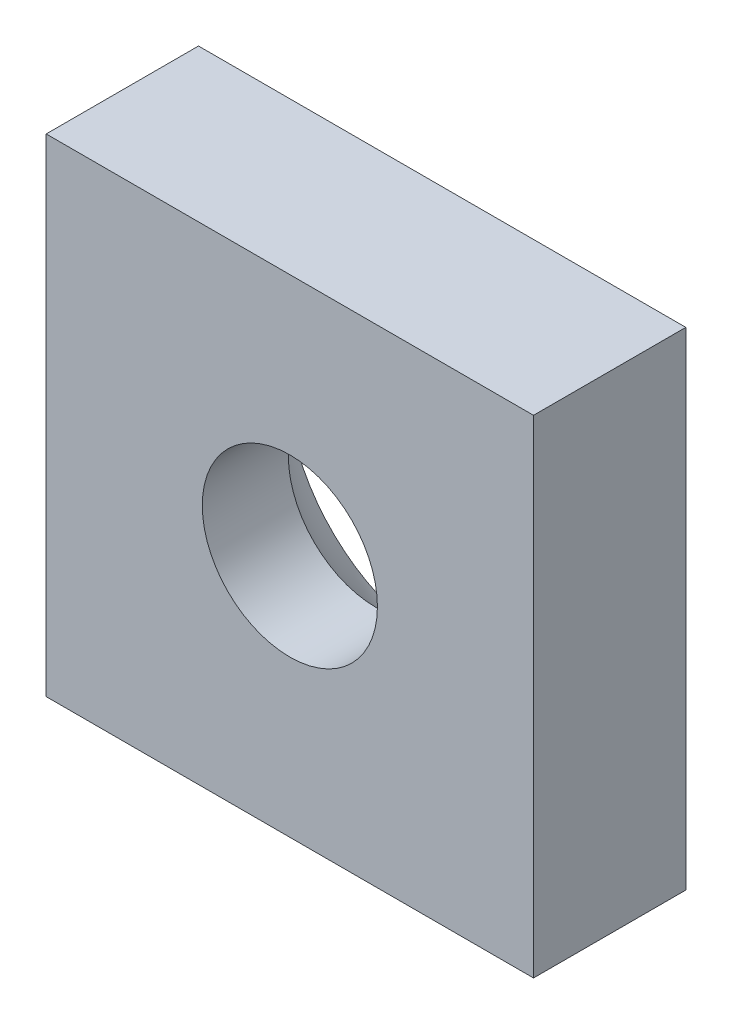
ISO-10303-21;
HEADER;
FILE_DESCRIPTION(('STEP AP214'),'2;1');
FILE_NAME('part.step','',(''),(''),'','','');
FILE_SCHEMA(('AUTOMOTIVE_DESIGN { 1 0 10303 214 1 1 1 1 }'));
ENDSEC;
DATA;
#1=APPLICATION_CONTEXT('core data for automotive mechanical design processes');
#2=APPLICATION_PROTOCOL_DEFINITION('international standard','automotive_design',2000,#1);
#3=PRODUCT_CONTEXT('',#1,'mechanical');
#4=PRODUCT('Part','Part','',(#3));
#5=PRODUCT_RELATED_PRODUCT_CATEGORY('part','',(#4));
#6=PRODUCT_DEFINITION_FORMATION('','',#4);
#7=PRODUCT_DEFINITION_CONTEXT('part definition',#1,'design');
#8=PRODUCT_DEFINITION('design','',#6,#7);
#9=PRODUCT_DEFINITION_SHAPE('','',#8);
#10=(LENGTH_UNIT() NAMED_UNIT(*) SI_UNIT(.MILLI.,.METRE.));
#11=(NAMED_UNIT(*) PLANE_ANGLE_UNIT() SI_UNIT($,.RADIAN.));
#12=(NAMED_UNIT(*) SI_UNIT($,.STERADIAN.) SOLID_ANGLE_UNIT());
#13=UNCERTAINTY_MEASURE_WITH_UNIT(LENGTH_MEASURE(1.E-05),#10,'distance_accuracy_value','');
#14=(GEOMETRIC_REPRESENTATION_CONTEXT(3) GLOBAL_UNCERTAINTY_ASSIGNED_CONTEXT((#13)) GLOBAL_UNIT_ASSIGNED_CONTEXT((#10,
#11,#12)) REPRESENTATION_CONTEXT('',''));
#15=CARTESIAN_POINT('',(0.,0.,0.));
#16=DIRECTION('',(0.,0.,1.));
#17=DIRECTION('',(1.,0.,0.));
#18=AXIS2_PLACEMENT_3D('',#15,#16,#17);
#19=CARTESIAN_POINT('',(25.4,-25.4,9.525));
#20=DIRECTION('',(0.,0.,1.));
#21=DIRECTION('',(1.,0.,0.));
#22=AXIS2_PLACEMENT_3D('',#19,#20,#21);
#23=PLANE('',#22);
#24=DIRECTION('',(0.,1.,0.));
#25=VECTOR('',#24,1.);
#26=CARTESIAN_POINT('',(-25.4,-25.4,9.525));
#27=LINE('',#26,#25);
#28=CARTESIAN_POINT('',(-25.4,-25.4,9.525));
#29=VERTEX_POINT('',#28);
#30=CARTESIAN_POINT('',(-25.4,25.4,9.525));
#31=VERTEX_POINT('',#30);
#32=EDGE_CURVE('E75',#29,#31,#27,.T.);
#33=ORIENTED_EDGE('',*,*,#32,.T.);
#34=DIRECTION('',(-1.,0.,0.));
#35=VECTOR('',#34,1.);
#36=CARTESIAN_POINT('',(25.4,25.4,9.525));
#37=LINE('',#36,#35);
#38=CARTESIAN_POINT('',(25.4,25.4,9.525));
#39=VERTEX_POINT('',#38);
#40=EDGE_CURVE('E41',#39,#31,#37,.T.);
#41=ORIENTED_EDGE('',*,*,#40,.F.);
#42=DIRECTION('',(0.,1.,0.));
#43=VECTOR('',#42,1.);
#44=CARTESIAN_POINT('',(25.4,-25.4,9.525));
#45=LINE('',#44,#43);
#46=CARTESIAN_POINT('',(25.4,-25.4,9.525));
#47=VERTEX_POINT('',#46);
#48=EDGE_CURVE('E87',#47,#39,#45,.T.);
#49=ORIENTED_EDGE('',*,*,#48,.F.);
#50=DIRECTION('',(-1.,0.,0.));
#51=VECTOR('',#50,1.);
#52=CARTESIAN_POINT('',(25.4,-25.4,9.525));
#53=LINE('',#52,#51);
#54=EDGE_CURVE('E11',#47,#29,#53,.T.);
#55=ORIENTED_EDGE('',*,*,#54,.T.);
#56=EDGE_LOOP('',(#33,#41,#49,#55));
#57=FACE_BOUND('',#56,.T.);
#58=CARTESIAN_POINT('',(0.,0.,9.525));
#59=DIRECTION('',(0.,0.,1.));
#60=DIRECTION('',(1.,0.,0.));
#61=AXIS2_PLACEMENT_3D('',#58,#59,#60);
#62=CIRCLE('',#61,16.2038264308157);
#63=CARTESIAN_POINT('',(0.,16.2038264308157,9.525));
#64=VERTEX_POINT('',#63);
#65=EDGE_CURVE('E36',#64,#64,#62,.F.);
#66=ORIENTED_EDGE('',*,*,#65,.F.);
#67=EDGE_LOOP('',(#66));
#68=FACE_BOUND('',#67,.T.);
#69=ADVANCED_FACE('F32',(#57,#68),#23,.F.);
#70=CARTESIAN_POINT('',(25.4,25.4,25.4));
#71=DIRECTION('',(0.,0.,-1.));
#72=DIRECTION('',(-1.,0.,0.));
#73=AXIS2_PLACEMENT_3D('',#70,#71,#72);
#74=PLANE('',#73);
#75=DIRECTION('',(0.,-1.,0.));
#76=VECTOR('',#75,1.);
#77=CARTESIAN_POINT('',(-25.4,25.4,25.4));
#78=LINE('',#77,#76);
#79=CARTESIAN_POINT('',(-25.4,25.4,25.4));
#80=VERTEX_POINT('',#79);
#81=CARTESIAN_POINT('',(-25.4,-25.4,25.4));
#82=VERTEX_POINT('',#81);
#83=EDGE_CURVE('E99',#80,#82,#78,.T.);
#84=ORIENTED_EDGE('',*,*,#83,.T.);
#85=DIRECTION('',(-1.,0.,0.));
#86=VECTOR('',#85,1.);
#87=CARTESIAN_POINT('',(25.4,-25.4,25.4));
#88=LINE('',#87,#86);
#89=CARTESIAN_POINT('',(25.4,-25.4,25.4));
#90=VERTEX_POINT('',#89);
#91=EDGE_CURVE('E91',#90,#82,#88,.T.);
#92=ORIENTED_EDGE('',*,*,#91,.F.);
#93=DIRECTION('',(0.,-1.,0.));
#94=VECTOR('',#93,1.);
#95=CARTESIAN_POINT('',(25.4,25.4,25.4));
#96=LINE('',#95,#94);
#97=CARTESIAN_POINT('',(25.4,25.4,25.4));
#98=VERTEX_POINT('',#97);
#99=EDGE_CURVE('E49',#98,#90,#96,.T.);
#100=ORIENTED_EDGE('',*,*,#99,.F.);
#101=DIRECTION('',(-1.,0.,0.));
#102=VECTOR('',#101,1.);
#103=CARTESIAN_POINT('',(25.4,25.4,25.4));
#104=LINE('',#103,#102);
#105=EDGE_CURVE('E107',#98,#80,#104,.T.);
#106=ORIENTED_EDGE('',*,*,#105,.T.);
#107=EDGE_LOOP('',(#84,#92,#100,#106));
#108=FACE_BOUND('',#107,.T.);
#109=CARTESIAN_POINT('',(0.,0.,25.4));
#110=DIRECTION('',(0.,0.,-1.));
#111=DIRECTION('',(-1.,0.,0.));
#112=AXIS2_PLACEMENT_3D('',#109,#110,#111);
#113=CIRCLE('',#112,9.128125);
#114=CARTESIAN_POINT('',(-9.128125,0.,25.4));
#115=VERTEX_POINT('',#114);
#116=EDGE_CURVE('E94',#115,#115,#113,.F.);
#117=ORIENTED_EDGE('',*,*,#116,.F.);
#118=EDGE_LOOP('',(#117));
#119=FACE_BOUND('',#118,.T.);
#120=ADVANCED_FACE('F127',(#108,#119),#74,.F.);
#121=CARTESIAN_POINT('',(25.4,-25.4,25.4));
#122=DIRECTION('',(0.,1.,0.));
#123=DIRECTION('',(0.,0.,1.));
#124=AXIS2_PLACEMENT_3D('',#121,#122,#123);
#125=PLANE('',#124);
#126=DIRECTION('',(0.,0.,-1.));
#127=VECTOR('',#126,1.);
#128=CARTESIAN_POINT('',(-25.4,-25.4,25.4));
#129=LINE('',#128,#127);
#130=EDGE_CURVE('E79',#82,#29,#129,.T.);
#131=ORIENTED_EDGE('',*,*,#130,.T.);
#132=ORIENTED_EDGE('',*,*,#54,.F.);
#133=DIRECTION('',(0.,0.,-1.));
#134=VECTOR('',#133,1.);
#135=CARTESIAN_POINT('',(25.4,-25.4,25.4));
#136=LINE('',#135,#134);
#137=EDGE_CURVE('E101',#90,#47,#136,.T.);
#138=ORIENTED_EDGE('',*,*,#137,.F.);
#139=ORIENTED_EDGE('',*,*,#91,.T.);
#140=EDGE_LOOP('',(#131,#132,#138,#139));
#141=FACE_BOUND('',#140,.T.);
#142=ADVANCED_FACE('F34',(#141),#125,.F.);
#143=CARTESIAN_POINT('',(25.4,25.4,9.525));
#144=DIRECTION('',(0.,-1.,0.));
#145=DIRECTION('',(0.,0.,-1.));
#146=AXIS2_PLACEMENT_3D('',#143,#144,#145);
#147=PLANE('',#146);
#148=DIRECTION('',(0.,0.,1.));
#149=VECTOR('',#148,1.);
#150=CARTESIAN_POINT('',(-25.4,25.4,9.525));
#151=LINE('',#150,#149);
#152=EDGE_CURVE('E80',#31,#80,#151,.T.);
#153=ORIENTED_EDGE('',*,*,#152,.T.);
#154=ORIENTED_EDGE('',*,*,#105,.F.);
#155=DIRECTION('',(0.,0.,1.));
#156=VECTOR('',#155,1.);
#157=CARTESIAN_POINT('',(25.4,25.4,9.525));
#158=LINE('',#157,#156);
#159=EDGE_CURVE('E54',#39,#98,#158,.T.);
#160=ORIENTED_EDGE('',*,*,#159,.F.);
#161=ORIENTED_EDGE('',*,*,#40,.T.);
#162=EDGE_LOOP('',(#153,#154,#160,#161));
#163=FACE_BOUND('',#162,.T.);
#164=ADVANCED_FACE('F134',(#163),#147,.F.);
#165=CARTESIAN_POINT('',(25.4,-25.4,9.525));
#166=DIRECTION('',(1.,0.,0.));
#167=DIRECTION('',(0.,0.,-1.));
#168=AXIS2_PLACEMENT_3D('',#165,#166,#167);
#169=PLANE('',#168);
#170=ORIENTED_EDGE('',*,*,#137,.T.);
#171=ORIENTED_EDGE('',*,*,#48,.T.);
#172=ORIENTED_EDGE('',*,*,#159,.T.);
#173=ORIENTED_EDGE('',*,*,#99,.T.);
#174=EDGE_LOOP('',(#170,#171,#172,#173));
#175=FACE_BOUND('',#174,.T.);
#176=ADVANCED_FACE('F136',(#175),#169,.T.);
#177=CARTESIAN_POINT('',(-25.4,-25.4,9.525));
#178=DIRECTION('',(1.,0.,0.));
#179=DIRECTION('',(0.,0.,-1.));
#180=AXIS2_PLACEMENT_3D('',#177,#178,#179);
#181=PLANE('',#180);
#182=ORIENTED_EDGE('',*,*,#130,.F.);
#183=ORIENTED_EDGE('',*,*,#83,.F.);
#184=ORIENTED_EDGE('',*,*,#152,.F.);
#185=ORIENTED_EDGE('',*,*,#32,.F.);
#186=EDGE_LOOP('',(#182,#183,#184,#185));
#187=FACE_BOUND('',#186,.T.);
#188=ADVANCED_FACE('F76',(#187),#181,.F.);
#189=CARTESIAN_POINT('',(0.,0.,0.));
#190=DIRECTION('',(0.,0.,1.));
#191=DIRECTION('',(0.,1.,0.));
#192=AXIS2_PLACEMENT_3D('',#189,#190,#191);
#193=SPHERICAL_SURFACE('',#192,18.796);
#194=CARTESIAN_POINT('',(0.,0.,16.4306710144283));
#195=DIRECTION('',(0.,0.,1.));
#196=DIRECTION('',(1.,0.,0.));
#197=AXIS2_PLACEMENT_3D('',#194,#195,#196);
#198=CIRCLE('',#197,9.128125);
#199=CARTESIAN_POINT('',(0.,9.128125,16.4306710144283));
#200=VERTEX_POINT('',#199);
#201=EDGE_CURVE('E96',#200,#200,#198,.T.);
#202=CARTESIAN_POINT('',(0.,9.128125,16.4306710144283));
#203=CARTESIAN_POINT('',(0.,9.21922634870602,16.3800593942815));
#204=CARTESIAN_POINT('',(0.,9.30990668159296,16.3286899486469));
#205=CARTESIAN_POINT('',(0.,9.49040041585019,16.2244499466355));
#206=CARTESIAN_POINT('',(0.,9.58021381722048,16.1715793902587));
#207=CARTESIAN_POINT('',(0.,9.75894878856588,16.0643517069961));
#208=CARTESIAN_POINT('',(0.,9.84787035854101,16.0099945801103));
#209=CARTESIAN_POINT('',(0.,10.0247970782357,15.899808818646));
#210=CARTESIAN_POINT('',(0.,10.1128022279553,15.8439801840674));
#211=CARTESIAN_POINT('',(0.,10.2878717546087,15.7308668473456));
#212=CARTESIAN_POINT('',(0.,10.3749361315426,15.6735821452024));
#213=CARTESIAN_POINT('',(0.,10.5481000249977,15.5575725243276));
#214=CARTESIAN_POINT('',(0.,10.634199541519,15.4988476055961));
#215=CARTESIAN_POINT('',(0.,10.8054098922393,15.3799737988535));
#216=CARTESIAN_POINT('',(0.,10.8905207264384,15.3198249108424));
#217=CARTESIAN_POINT('',(0.,11.05973016448,15.1981198074006));
#218=CARTESIAN_POINT('',(0.,11.1438287683227,15.1365635919699));
#219=CARTESIAN_POINT('',(0.,11.3109904775886,15.0120608647686));
#220=CARTESIAN_POINT('',(0.,11.3940535830117,14.949114352998));
#221=CARTESIAN_POINT('',(0.,11.5591213138964,14.8218484488992));
#222=CARTESIAN_POINT('',(0.,11.6411259393579,14.7575290565709));
#223=CARTESIAN_POINT('',(0.,11.8040540216266,14.6275351869704));
#224=CARTESIAN_POINT('',(0.,11.8849774784337,14.5618607096983));
#225=CARTESIAN_POINT('',(0.,12.0457208338358,14.4291748407463));
#226=CARTESIAN_POINT('',(0.,12.1255407324306,14.3621634490663));
#227=CARTESIAN_POINT('',(0.,12.2840548871776,14.2268222917256));
#228=CARTESIAN_POINT('',(0.,12.3627491433296,14.1584925260648));
#229=CARTESIAN_POINT('',(0.,12.5189902403985,14.0205335259518));
#230=CARTESIAN_POINT('',(0.,12.5965370813152,13.9509042914996));
#231=CARTESIAN_POINT('',(0.,12.750461892583,13.8103656185244));
#232=CARTESIAN_POINT('',(0.,12.826839862934,13.7394561800014));
#233=CARTESIAN_POINT('',(0.,12.9784058011378,13.596376717807));
#234=CARTESIAN_POINT('',(0.,13.0535937689907,13.5242066941355));
#235=CARTESIAN_POINT('',(0.,13.2027588995107,13.3786260293396));
#236=CARTESIAN_POINT('',(0.,13.2767360621778,13.3052153882152));
#237=CARTESIAN_POINT('',(0.,13.4234591146393,13.1571737994577));
#238=CARTESIAN_POINT('',(0.,13.4962050044337,13.0825428518247));
#239=CARTESIAN_POINT('',(0.,13.6404453841259,12.9320812986235));
#240=CARTESIAN_POINT('',(0.,13.7119398740238,12.8562506930554));
#241=CARTESIAN_POINT('',(0.,13.8536576731312,12.7034108044739));
#242=CARTESIAN_POINT('',(0.,13.9238809823408,12.6264015214605));
#243=CARTESIAN_POINT('',(0.,14.0630369909848,12.4712255845897));
#244=CARTESIAN_POINT('',(0.,14.1319696904192,12.3930589307323));
#245=CARTESIAN_POINT('',(0.,14.2685254075065,12.2355898789913));
#246=CARTESIAN_POINT('',(0.,14.3361484251595,12.1562874811077));
#247=CARTESIAN_POINT('',(0.,14.4700660690341,11.9965688823644));
#248=CARTESIAN_POINT('',(0.,14.5363606952557,11.9161526815048));
#249=CARTESIAN_POINT('',(0.,14.6676032141545,11.7542287260237));
#250=CARTESIAN_POINT('',(0.,14.7325511068315,11.6727209714022));
#251=CARTESIAN_POINT('',(0.,14.8610821891255,11.5086364596116));
#252=CARTESIAN_POINT('',(0.,14.9246653787424,11.4260597024424));
#253=CARTESIAN_POINT('',(0.,15.0504494630213,11.2598600325622));
#254=CARTESIAN_POINT('',(0.,15.1126503576833,11.1762371198512));
#255=CARTESIAN_POINT('',(0.,15.2356526424535,11.0079682752466));
#256=CARTESIAN_POINT('',(0.,15.2964540325618,10.9233223433531));
#257=CARTESIAN_POINT('',(0.,15.4166404864001,10.7530308801325));
#258=CARTESIAN_POINT('',(0.,15.4760255501303,10.6673853488055));
#259=CARTESIAN_POINT('',(0.,15.593362919141,10.4951183817438));
#260=CARTESIAN_POINT('',(0.,15.6513152244217,10.4084969460092));
#261=CARTESIAN_POINT('',(0.,15.7657710487468,10.2343021399745));
#262=CARTESIAN_POINT('',(0.,15.8222745677914,10.1467287696745));
#263=CARTESIAN_POINT('',(0.,15.9338171633108,9.97065430978749));
#264=CARTESIAN_POINT('',(0.,15.9888562397856,9.88215322020046));
#265=CARTESIAN_POINT('',(0.,16.0974548086968,9.70424786065244));
#266=CARTESIAN_POINT('',(0.,16.1510143011331,9.61484359069145));
#267=CARTESIAN_POINT('',(0.,16.2038264308157,9.525));
#268=B_SPLINE_CURVE_WITH_KNOTS('',3,(#202,#203,#204,#205,#206,#207,#208,#209,#210,#211,#212,
#213,#214,#215,#216,#217,#218,#219,#220,#221,#222,#223,#224,#225,#226,#227,#228,#229,#230,#231,
#232,#233,#234,#235,#236,#237,#238,#239,#240,#241,#242,#243,#244,#245,#246,#247,#248,#249,#250,
#251,#252,#253,#254,#255,#256,#257,#258,#259,#260,#261,#262,#263,#264,#265,#266,#267),
.UNSPECIFIED.,.F.,.F.,(4,2,2,2,2,2,2,2,2,2,2,2,2,2,2,2,2,2,2,2,2,2,2,2,2,2,2,2,2,2,2,2,4),(0.,
0.312644638694632,0.625289277389264,0.937933916083893,1.25057855477853,1.56322319347316,
1.87586783216779,2.18851247086242,2.50115710955705,2.81380174825168,3.12644638694631,
3.43909102564094,3.75173566433557,4.0643803030302,4.37702494172483,4.68966958041946,
5.0023142191141,5.31495885780873,5.62760349650336,5.94024813519799,6.25289277389262,
6.56553741258725,6.87818205128188,7.19082668997651,7.50347132867114,7.81611596736577,
8.1287606060604,8.44140524475503,8.75404988344967,9.0666945221443,9.37933916083893,
9.69198379953356,10.0046284382282),.UNSPECIFIED.);
#269=EDGE_CURVE('BSEAM116',#200,#64,#268,.T.);
#270=ORIENTED_EDGE('',*,*,#201,.T.);
#271=ORIENTED_EDGE('',*,*,#65,.T.);
#272=ORIENTED_EDGE('',*,*,#269,.T.);
#273=ORIENTED_EDGE('',*,*,#269,.F.);
#274=EDGE_LOOP('',(#270,#272,#271,#273));
#275=FACE_BOUND('',#274,.T.);
#276=ADVANCED_FACE('F116',(#275),#193,.F.);
#277=CARTESIAN_POINT('',(0.,0.,0.));
#278=DIRECTION('',(0.,0.,1.));
#279=DIRECTION('',(1.,0.,0.));
#280=AXIS2_PLACEMENT_3D('',#277,#278,#279);
#281=CYLINDRICAL_SURFACE('',#280,9.128125);
#282=ORIENTED_EDGE('',*,*,#201,.F.);
#283=EDGE_LOOP('',(#282));
#284=FACE_BOUND('',#283,.T.);
#285=ORIENTED_EDGE('',*,*,#116,.T.);
#286=EDGE_LOOP('',(#285));
#287=FACE_BOUND('',#286,.T.);
#288=ADVANCED_FACE('F119',(#284,#287),#281,.F.);
#289=CLOSED_SHELL('',(#69,#120,#142,#164,#176,#188,#276,#288));
#290=MANIFOLD_SOLID_BREP('B2',#289);
#291=ADVANCED_BREP_SHAPE_REPRESENTATION('',(#18,#290),#14);
#292=SHAPE_DEFINITION_REPRESENTATION(#9,#291);
ENDSEC;
END-ISO-10303-21;
